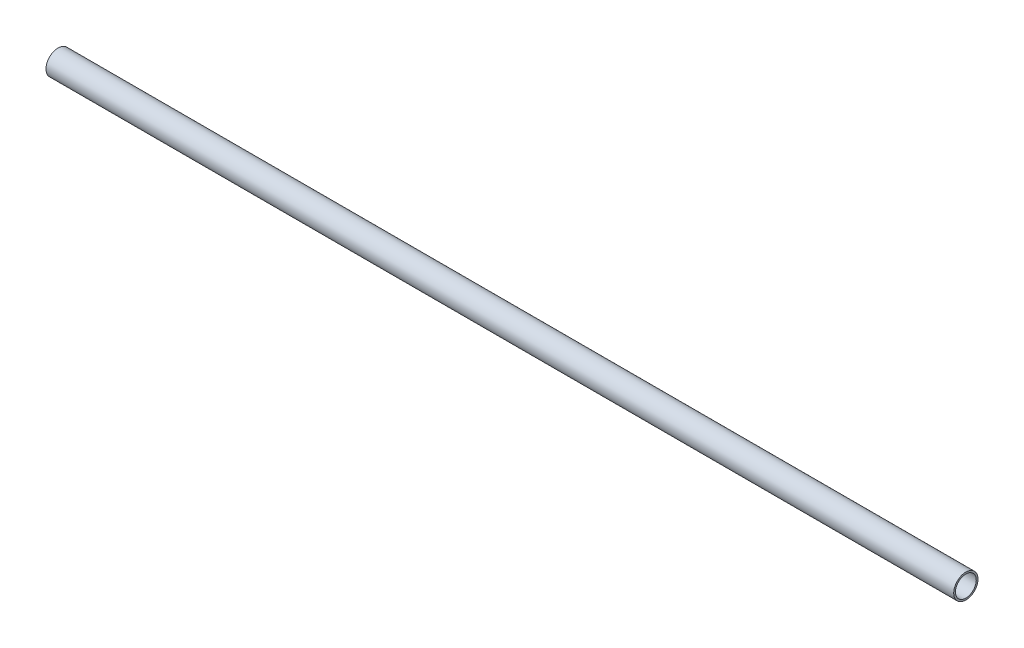
ISO-10303-21;
HEADER;
FILE_DESCRIPTION(('STEP AP214'),'2;1');
FILE_NAME('part.step','',(''),(''),'','','');
FILE_SCHEMA(('AUTOMOTIVE_DESIGN { 1 0 10303 214 1 1 1 1 }'));
ENDSEC;
DATA;
#1=APPLICATION_CONTEXT('core data for automotive mechanical design processes');
#2=APPLICATION_PROTOCOL_DEFINITION('international standard','automotive_design',2000,#1);
#3=PRODUCT_CONTEXT('',#1,'mechanical');
#4=PRODUCT('Part','Part','',(#3));
#5=PRODUCT_RELATED_PRODUCT_CATEGORY('part','',(#4));
#6=PRODUCT_DEFINITION_FORMATION('','',#4);
#7=PRODUCT_DEFINITION_CONTEXT('part definition',#1,'design');
#8=PRODUCT_DEFINITION('design','',#6,#7);
#9=PRODUCT_DEFINITION_SHAPE('','',#8);
#10=(LENGTH_UNIT() NAMED_UNIT(*) SI_UNIT(.MILLI.,.METRE.));
#11=(NAMED_UNIT(*) PLANE_ANGLE_UNIT() SI_UNIT($,.RADIAN.));
#12=(NAMED_UNIT(*) SI_UNIT($,.STERADIAN.) SOLID_ANGLE_UNIT());
#13=UNCERTAINTY_MEASURE_WITH_UNIT(LENGTH_MEASURE(1.E-05),#10,'distance_accuracy_value','');
#14=(GEOMETRIC_REPRESENTATION_CONTEXT(3) GLOBAL_UNCERTAINTY_ASSIGNED_CONTEXT((#13)) GLOBAL_UNIT_ASSIGNED_CONTEXT((#10,
#11,#12)) REPRESENTATION_CONTEXT('',''));
#15=CARTESIAN_POINT('',(0.,0.,0.));
#16=DIRECTION('',(0.,0.,1.));
#17=DIRECTION('',(1.,0.,0.));
#18=AXIS2_PLACEMENT_3D('',#15,#16,#17);
#19=CARTESIAN_POINT('',(261.5,0.,0.));
#20=DIRECTION('',(1.,0.,0.));
#21=DIRECTION('',(0.,0.,-1.));
#22=AXIS2_PLACEMENT_3D('',#19,#20,#21);
#23=PLANE('',#22);
#24=CARTESIAN_POINT('',(261.5,0.,0.));
#25=DIRECTION('',(1.,0.,0.));
#26=DIRECTION('',(0.,0.,-1.));
#27=AXIS2_PLACEMENT_3D('',#24,#25,#26);
#28=CIRCLE('',#27,7.);
#29=CARTESIAN_POINT('',(261.5,0.,-7.));
#30=VERTEX_POINT('',#29);
#31=EDGE_CURVE('E10',#30,#30,#28,.T.);
#32=ORIENTED_EDGE('',*,*,#31,.T.);
#33=EDGE_LOOP('',(#32));
#34=FACE_BOUND('',#33,.T.);
#35=CARTESIAN_POINT('',(261.5,0.,0.));
#36=DIRECTION('',(1.,0.,0.));
#37=DIRECTION('',(0.,0.,-1.));
#38=AXIS2_PLACEMENT_3D('',#35,#36,#37);
#39=CIRCLE('',#38,6.);
#40=CARTESIAN_POINT('',(261.5,0.,-6.));
#41=VERTEX_POINT('',#40);
#42=EDGE_CURVE('E47',#41,#41,#39,.T.);
#43=ORIENTED_EDGE('',*,*,#42,.F.);
#44=EDGE_LOOP('',(#43));
#45=FACE_BOUND('',#44,.T.);
#46=ADVANCED_FACE('F36',(#34,#45),#23,.T.);
#47=CARTESIAN_POINT('',(-261.5,0.,0.));
#48=DIRECTION('',(1.,0.,0.));
#49=DIRECTION('',(0.,0.,-1.));
#50=AXIS2_PLACEMENT_3D('',#47,#48,#49);
#51=PLANE('',#50);
#52=CARTESIAN_POINT('',(-261.5,0.,0.));
#53=DIRECTION('',(1.,0.,0.));
#54=DIRECTION('',(0.,0.,-1.));
#55=AXIS2_PLACEMENT_3D('',#52,#53,#54);
#56=CIRCLE('',#55,7.);
#57=CARTESIAN_POINT('',(-261.5,0.,-7.));
#58=VERTEX_POINT('',#57);
#59=EDGE_CURVE('E40',#58,#58,#56,.T.);
#60=ORIENTED_EDGE('',*,*,#59,.F.);
#61=EDGE_LOOP('',(#60));
#62=FACE_BOUND('',#61,.T.);
#63=CARTESIAN_POINT('',(-261.5,0.,0.));
#64=DIRECTION('',(1.,0.,0.));
#65=DIRECTION('',(0.,0.,-1.));
#66=AXIS2_PLACEMENT_3D('',#63,#64,#65);
#67=CIRCLE('',#66,6.);
#68=CARTESIAN_POINT('',(-261.5,0.,-6.));
#69=VERTEX_POINT('',#68);
#70=EDGE_CURVE('E49',#69,#69,#67,.T.);
#71=ORIENTED_EDGE('',*,*,#70,.T.);
#72=EDGE_LOOP('',(#71));
#73=FACE_BOUND('',#72,.T.);
#74=ADVANCED_FACE('F59',(#62,#73),#51,.F.);
#75=CARTESIAN_POINT('',(261.5,0.,0.));
#76=DIRECTION('',(-1.,0.,0.));
#77=DIRECTION('',(0.,0.,1.));
#78=AXIS2_PLACEMENT_3D('',#75,#76,#77);
#79=CYLINDRICAL_SURFACE('',#78,7.);
#80=ORIENTED_EDGE('',*,*,#31,.F.);
#81=EDGE_LOOP('',(#80));
#82=FACE_BOUND('',#81,.T.);
#83=ORIENTED_EDGE('',*,*,#59,.T.);
#84=EDGE_LOOP('',(#83));
#85=FACE_BOUND('',#84,.T.);
#86=ADVANCED_FACE('F38',(#82,#85),#79,.T.);
#87=CARTESIAN_POINT('',(261.5,0.,0.));
#88=DIRECTION('',(-1.,0.,0.));
#89=DIRECTION('',(0.,0.,1.));
#90=AXIS2_PLACEMENT_3D('',#87,#88,#89);
#91=CYLINDRICAL_SURFACE('',#90,6.);
#92=ORIENTED_EDGE('',*,*,#42,.T.);
#93=EDGE_LOOP('',(#92));
#94=FACE_BOUND('',#93,.T.);
#95=ORIENTED_EDGE('',*,*,#70,.F.);
#96=EDGE_LOOP('',(#95));
#97=FACE_BOUND('',#96,.T.);
#98=ADVANCED_FACE('F55',(#94,#97),#91,.F.);
#99=CLOSED_SHELL('',(#46,#74,#86,#98));
#100=MANIFOLD_SOLID_BREP('B2',#99);
#101=ADVANCED_BREP_SHAPE_REPRESENTATION('',(#18,#100),#14);
#102=SHAPE_DEFINITION_REPRESENTATION(#9,#101);
ENDSEC;
END-ISO-10303-21;
